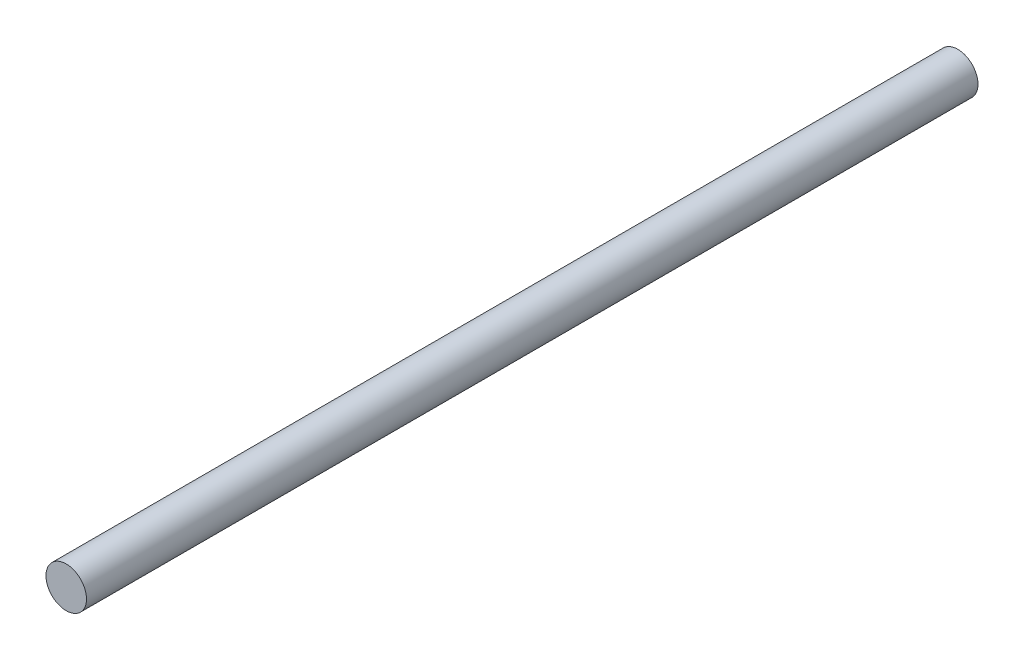
ISO-10303-21;
HEADER;
FILE_DESCRIPTION(('STEP AP214'),'2;1');
FILE_NAME('part.step','',(''),(''),'','','');
FILE_SCHEMA(('AUTOMOTIVE_DESIGN { 1 0 10303 214 1 1 1 1 }'));
ENDSEC;
DATA;
#1=APPLICATION_CONTEXT('core data for automotive mechanical design processes');
#2=APPLICATION_PROTOCOL_DEFINITION('international standard','automotive_design',2000,#1);
#3=PRODUCT_CONTEXT('',#1,'mechanical');
#4=PRODUCT('Part','Part','',(#3));
#5=PRODUCT_RELATED_PRODUCT_CATEGORY('part','',(#4));
#6=PRODUCT_DEFINITION_FORMATION('','',#4);
#7=PRODUCT_DEFINITION_CONTEXT('part definition',#1,'design');
#8=PRODUCT_DEFINITION('design','',#6,#7);
#9=PRODUCT_DEFINITION_SHAPE('','',#8);
#10=(LENGTH_UNIT() NAMED_UNIT(*) SI_UNIT(.MILLI.,.METRE.));
#11=(NAMED_UNIT(*) PLANE_ANGLE_UNIT() SI_UNIT($,.RADIAN.));
#12=(NAMED_UNIT(*) SI_UNIT($,.STERADIAN.) SOLID_ANGLE_UNIT());
#13=UNCERTAINTY_MEASURE_WITH_UNIT(LENGTH_MEASURE(1.E-05),#10,'distance_accuracy_value','');
#14=(GEOMETRIC_REPRESENTATION_CONTEXT(3) GLOBAL_UNCERTAINTY_ASSIGNED_CONTEXT((#13)) GLOBAL_UNIT_ASSIGNED_CONTEXT((#10,
#11,#12)) REPRESENTATION_CONTEXT('',''));
#15=CARTESIAN_POINT('',(0.,0.,0.));
#16=DIRECTION('',(0.,0.,1.));
#17=DIRECTION('',(1.,0.,0.));
#18=AXIS2_PLACEMENT_3D('',#15,#16,#17);
#19=CARTESIAN_POINT('',(0.,0.,550.));
#20=DIRECTION('',(0.,0.,-1.));
#21=DIRECTION('',(-1.,0.,0.));
#22=AXIS2_PLACEMENT_3D('',#19,#20,#21);
#23=CYLINDRICAL_SURFACE('',#22,12.5);
#24=CARTESIAN_POINT('',(0.,0.,550.));
#25=DIRECTION('',(0.,0.,1.));
#26=DIRECTION('',(1.,0.,0.));
#27=AXIS2_PLACEMENT_3D('',#24,#25,#26);
#28=CIRCLE('',#27,12.5);
#29=CARTESIAN_POINT('',(12.5,0.,550.));
#30=VERTEX_POINT('',#29);
#31=EDGE_CURVE('E10',#30,#30,#28,.T.);
#32=ORIENTED_EDGE('',*,*,#31,.F.);
#33=EDGE_LOOP('',(#32));
#34=FACE_BOUND('',#33,.T.);
#35=CARTESIAN_POINT('',(0.,0.,0.));
#36=DIRECTION('',(0.,0.,1.));
#37=DIRECTION('',(1.,0.,0.));
#38=AXIS2_PLACEMENT_3D('',#35,#36,#37);
#39=CIRCLE('',#38,12.5);
#40=CARTESIAN_POINT('',(12.5,0.,0.));
#41=VERTEX_POINT('',#40);
#42=EDGE_CURVE('E39',#41,#41,#39,.T.);
#43=ORIENTED_EDGE('',*,*,#42,.T.);
#44=EDGE_LOOP('',(#43));
#45=FACE_BOUND('',#44,.T.);
#46=ADVANCED_FACE('F36',(#34,#45),#23,.T.);
#47=CARTESIAN_POINT('',(0.,0.,550.));
#48=DIRECTION('',(0.,0.,1.));
#49=DIRECTION('',(1.,0.,0.));
#50=AXIS2_PLACEMENT_3D('',#47,#48,#49);
#51=PLANE('',#50);
#52=ORIENTED_EDGE('',*,*,#31,.T.);
#53=EDGE_LOOP('',(#52));
#54=FACE_BOUND('',#53,.T.);
#55=ADVANCED_FACE('F51',(#54),#51,.T.);
#56=CARTESIAN_POINT('',(0.,0.,0.));
#57=DIRECTION('',(0.,0.,1.));
#58=DIRECTION('',(1.,0.,0.));
#59=AXIS2_PLACEMENT_3D('',#56,#57,#58);
#60=PLANE('',#59);
#61=ORIENTED_EDGE('',*,*,#42,.F.);
#62=EDGE_LOOP('',(#61));
#63=FACE_BOUND('',#62,.T.);
#64=ADVANCED_FACE('F49',(#63),#60,.F.);
#65=CLOSED_SHELL('',(#46,#55,#64));
#66=MANIFOLD_SOLID_BREP('B2',#65);
#67=ADVANCED_BREP_SHAPE_REPRESENTATION('',(#18,#66),#14);
#68=SHAPE_DEFINITION_REPRESENTATION(#9,#67);
ENDSEC;
END-ISO-10303-21;
